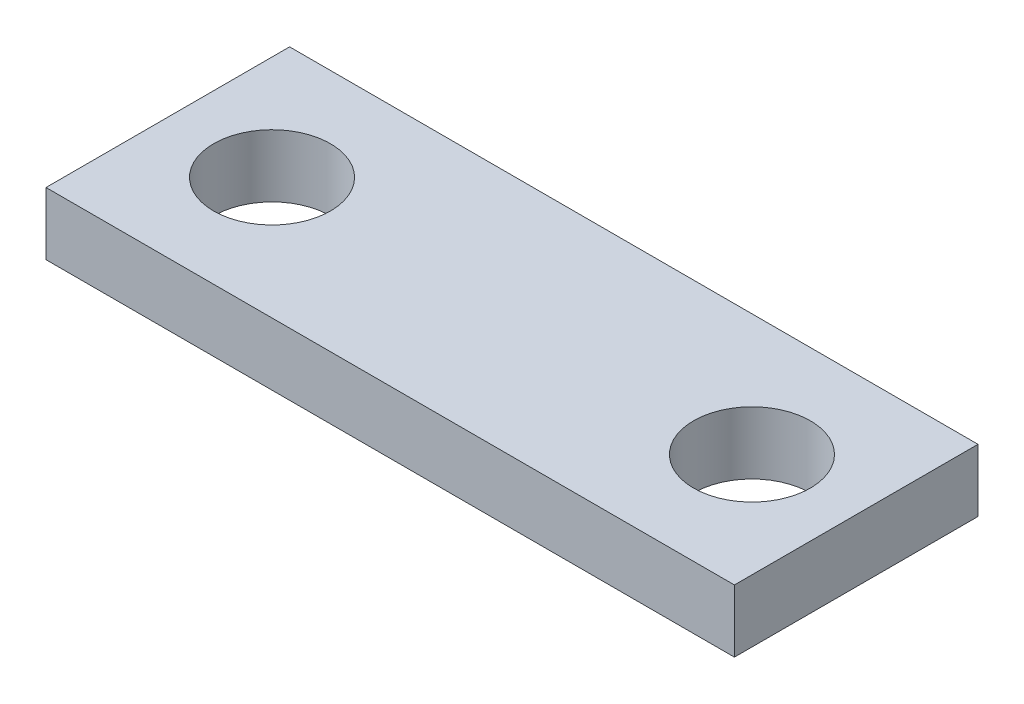
ISO-10303-21;
HEADER;
FILE_DESCRIPTION(('STEP AP214'),'2;1');
FILE_NAME('part.step','',(''),(''),'','','');
FILE_SCHEMA(('AUTOMOTIVE_DESIGN { 1 0 10303 214 1 1 1 1 }'));
ENDSEC;
DATA;
#1=APPLICATION_CONTEXT('core data for automotive mechanical design processes');
#2=APPLICATION_PROTOCOL_DEFINITION('international standard','automotive_design',2000,#1);
#3=PRODUCT_CONTEXT('',#1,'mechanical');
#4=PRODUCT('Part','Part','',(#3));
#5=PRODUCT_RELATED_PRODUCT_CATEGORY('part','',(#4));
#6=PRODUCT_DEFINITION_FORMATION('','',#4);
#7=PRODUCT_DEFINITION_CONTEXT('part definition',#1,'design');
#8=PRODUCT_DEFINITION('design','',#6,#7);
#9=PRODUCT_DEFINITION_SHAPE('','',#8);
#10=(LENGTH_UNIT() NAMED_UNIT(*) SI_UNIT(.MILLI.,.METRE.));
#11=(NAMED_UNIT(*) PLANE_ANGLE_UNIT() SI_UNIT($,.RADIAN.));
#12=(NAMED_UNIT(*) SI_UNIT($,.STERADIAN.) SOLID_ANGLE_UNIT());
#13=UNCERTAINTY_MEASURE_WITH_UNIT(LENGTH_MEASURE(1.E-05),#10,'distance_accuracy_value','');
#14=(GEOMETRIC_REPRESENTATION_CONTEXT(3) GLOBAL_UNCERTAINTY_ASSIGNED_CONTEXT((#13)) GLOBAL_UNIT_ASSIGNED_CONTEXT((#10,
#11,#12)) REPRESENTATION_CONTEXT('',''));
#15=CARTESIAN_POINT('',(0.,0.,0.));
#16=DIRECTION('',(0.,0.,1.));
#17=DIRECTION('',(1.,0.,0.));
#18=AXIS2_PLACEMENT_3D('',#15,#16,#17);
#19=CARTESIAN_POINT('',(8.255,1.5,2.921));
#20=DIRECTION('',(-1.,0.,0.));
#21=DIRECTION('',(0.,0.,1.));
#22=AXIS2_PLACEMENT_3D('',#19,#20,#21);
#23=PLANE('',#22);
#24=DIRECTION('',(0.,0.,-1.));
#25=VECTOR('',#24,1.);
#26=CARTESIAN_POINT('',(8.255,0.,2.921));
#27=LINE('',#26,#25);
#28=CARTESIAN_POINT('',(8.255,0.,2.921));
#29=VERTEX_POINT('',#28);
#30=CARTESIAN_POINT('',(8.255,0.,-2.921));
#31=VERTEX_POINT('',#30);
#32=EDGE_CURVE('E96',#29,#31,#27,.T.);
#33=ORIENTED_EDGE('',*,*,#32,.T.);
#34=DIRECTION('',(0.,-1.,0.));
#35=VECTOR('',#34,1.);
#36=CARTESIAN_POINT('',(8.255,1.5,-2.921));
#37=LINE('',#36,#35);
#38=CARTESIAN_POINT('',(8.255,1.5,-2.921));
#39=VERTEX_POINT('',#38);
#40=EDGE_CURVE('E11',#39,#31,#37,.T.);
#41=ORIENTED_EDGE('',*,*,#40,.F.);
#42=DIRECTION('',(0.,0.,-1.));
#43=VECTOR('',#42,1.);
#44=CARTESIAN_POINT('',(8.255,1.5,2.921));
#45=LINE('',#44,#43);
#46=CARTESIAN_POINT('',(8.255,1.5,2.921));
#47=VERTEX_POINT('',#46);
#48=EDGE_CURVE('E84',#47,#39,#45,.T.);
#49=ORIENTED_EDGE('',*,*,#48,.F.);
#50=DIRECTION('',(0.,-1.,0.));
#51=VECTOR('',#50,1.);
#52=CARTESIAN_POINT('',(8.255,1.5,2.921));
#53=LINE('',#52,#51);
#54=EDGE_CURVE('E92',#47,#29,#53,.T.);
#55=ORIENTED_EDGE('',*,*,#54,.T.);
#56=EDGE_LOOP('',(#33,#41,#49,#55));
#57=FACE_BOUND('',#56,.T.);
#58=ADVANCED_FACE('F33',(#57),#23,.F.);
#59=CARTESIAN_POINT('',(-8.255,1.5,-2.921));
#60=DIRECTION('',(0.,0.,1.));
#61=DIRECTION('',(1.,0.,0.));
#62=AXIS2_PLACEMENT_3D('',#59,#60,#61);
#63=PLANE('',#62);
#64=DIRECTION('',(-1.,0.,0.));
#65=VECTOR('',#64,1.);
#66=CARTESIAN_POINT('',(-8.255,0.,-2.921));
#67=LINE('',#66,#65);
#68=CARTESIAN_POINT('',(-8.255,0.,-2.921));
#69=VERTEX_POINT('',#68);
#70=EDGE_CURVE('E88',#31,#69,#67,.T.);
#71=ORIENTED_EDGE('',*,*,#70,.T.);
#72=DIRECTION('',(0.,-1.,0.));
#73=VECTOR('',#72,1.);
#74=CARTESIAN_POINT('',(-8.255,1.5,-2.921));
#75=LINE('',#74,#73);
#76=CARTESIAN_POINT('',(-8.255,1.5,-2.921));
#77=VERTEX_POINT('',#76);
#78=EDGE_CURVE('E41',#77,#69,#75,.T.);
#79=ORIENTED_EDGE('',*,*,#78,.F.);
#80=DIRECTION('',(-1.,0.,0.));
#81=VECTOR('',#80,1.);
#82=CARTESIAN_POINT('',(-8.255,1.5,-2.921));
#83=LINE('',#82,#81);
#84=EDGE_CURVE('E79',#39,#77,#83,.T.);
#85=ORIENTED_EDGE('',*,*,#84,.F.);
#86=ORIENTED_EDGE('',*,*,#40,.T.);
#87=EDGE_LOOP('',(#71,#79,#85,#86));
#88=FACE_BOUND('',#87,.T.);
#89=ADVANCED_FACE('F87',(#88),#63,.F.);
#90=CARTESIAN_POINT('',(-8.255,1.5,2.921));
#91=DIRECTION('',(1.,0.,0.));
#92=DIRECTION('',(0.,0.,-1.));
#93=AXIS2_PLACEMENT_3D('',#90,#91,#92);
#94=PLANE('',#93);
#95=DIRECTION('',(0.,0.,1.));
#96=VECTOR('',#95,1.);
#97=CARTESIAN_POINT('',(-8.255,0.,2.921));
#98=LINE('',#97,#96);
#99=CARTESIAN_POINT('',(-8.255,0.,2.921));
#100=VERTEX_POINT('',#99);
#101=EDGE_CURVE('E66',#69,#100,#98,.T.);
#102=ORIENTED_EDGE('',*,*,#101,.T.);
#103=DIRECTION('',(0.,-1.,0.));
#104=VECTOR('',#103,1.);
#105=CARTESIAN_POINT('',(-8.255,1.5,2.921));
#106=LINE('',#105,#104);
#107=CARTESIAN_POINT('',(-8.255,1.5,2.921));
#108=VERTEX_POINT('',#107);
#109=EDGE_CURVE('E89',#108,#100,#106,.T.);
#110=ORIENTED_EDGE('',*,*,#109,.F.);
#111=DIRECTION('',(0.,0.,1.));
#112=VECTOR('',#111,1.);
#113=CARTESIAN_POINT('',(-8.255,1.5,2.921));
#114=LINE('',#113,#112);
#115=EDGE_CURVE('E82',#77,#108,#114,.T.);
#116=ORIENTED_EDGE('',*,*,#115,.F.);
#117=ORIENTED_EDGE('',*,*,#78,.T.);
#118=EDGE_LOOP('',(#102,#110,#116,#117));
#119=FACE_BOUND('',#118,.T.);
#120=ADVANCED_FACE('F90',(#119),#94,.F.);
#121=CARTESIAN_POINT('',(-8.255,1.5,2.921));
#122=DIRECTION('',(0.,0.,-1.));
#123=DIRECTION('',(-1.,0.,0.));
#124=AXIS2_PLACEMENT_3D('',#121,#122,#123);
#125=PLANE('',#124);
#126=DIRECTION('',(1.,0.,0.));
#127=VECTOR('',#126,1.);
#128=CARTESIAN_POINT('',(-8.255,0.,2.921));
#129=LINE('',#128,#127);
#130=EDGE_CURVE('E72',#100,#29,#129,.T.);
#131=ORIENTED_EDGE('',*,*,#130,.T.);
#132=ORIENTED_EDGE('',*,*,#54,.F.);
#133=DIRECTION('',(1.,0.,0.));
#134=VECTOR('',#133,1.);
#135=CARTESIAN_POINT('',(-8.255,1.5,2.921));
#136=LINE('',#135,#134);
#137=EDGE_CURVE('E49',#108,#47,#136,.T.);
#138=ORIENTED_EDGE('',*,*,#137,.F.);
#139=ORIENTED_EDGE('',*,*,#109,.T.);
#140=EDGE_LOOP('',(#131,#132,#138,#139));
#141=FACE_BOUND('',#140,.T.);
#142=ADVANCED_FACE('F104',(#141),#125,.F.);
#143=CARTESIAN_POINT('',(0.,1.5,0.));
#144=DIRECTION('',(0.,-1.,0.));
#145=DIRECTION('',(0.,0.,-1.));
#146=AXIS2_PLACEMENT_3D('',#143,#144,#145);
#147=PLANE('',#146);
#148=CARTESIAN_POINT('',(5.755,1.5,0.));
#149=DIRECTION('',(0.,1.,0.));
#150=DIRECTION('',(0.,0.,1.));
#151=AXIS2_PLACEMENT_3D('',#148,#149,#150);
#152=CIRCLE('',#151,1.4);
#153=CARTESIAN_POINT('',(5.755,1.5,1.4));
#154=VERTEX_POINT('',#153);
#155=EDGE_CURVE('E116',#154,#154,#152,.T.);
#156=ORIENTED_EDGE('',*,*,#155,.F.);
#157=EDGE_LOOP('',(#156));
#158=FACE_BOUND('',#157,.T.);
#159=CARTESIAN_POINT('',(-5.755,1.5,0.));
#160=DIRECTION('',(0.,1.,0.));
#161=DIRECTION('',(0.,0.,1.));
#162=AXIS2_PLACEMENT_3D('',#159,#160,#161);
#163=CIRCLE('',#162,1.4);
#164=CARTESIAN_POINT('',(-5.755,1.5,1.4));
#165=VERTEX_POINT('',#164);
#166=EDGE_CURVE('E110',#165,#165,#163,.T.);
#167=ORIENTED_EDGE('',*,*,#166,.F.);
#168=EDGE_LOOP('',(#167));
#169=FACE_BOUND('',#168,.T.);
#170=ORIENTED_EDGE('',*,*,#48,.T.);
#171=ORIENTED_EDGE('',*,*,#84,.T.);
#172=ORIENTED_EDGE('',*,*,#115,.T.);
#173=ORIENTED_EDGE('',*,*,#137,.T.);
#174=EDGE_LOOP('',(#170,#171,#172,#173));
#175=FACE_BOUND('',#174,.T.);
#176=ADVANCED_FACE('F80',(#158,#169,#175),#147,.F.);
#177=CARTESIAN_POINT('',(0.,0.,0.));
#178=DIRECTION('',(0.,-1.,0.));
#179=DIRECTION('',(0.,0.,-1.));
#180=AXIS2_PLACEMENT_3D('',#177,#178,#179);
#181=PLANE('',#180);
#182=CARTESIAN_POINT('',(5.755,0.,0.));
#183=DIRECTION('',(0.,1.,0.));
#184=DIRECTION('',(0.,0.,1.));
#185=AXIS2_PLACEMENT_3D('',#182,#183,#184);
#186=CIRCLE('',#185,1.4);
#187=CARTESIAN_POINT('',(5.755,0.,1.4));
#188=VERTEX_POINT('',#187);
#189=EDGE_CURVE('E113',#188,#188,#186,.T.);
#190=ORIENTED_EDGE('',*,*,#189,.T.);
#191=EDGE_LOOP('',(#190));
#192=FACE_BOUND('',#191,.T.);
#193=CARTESIAN_POINT('',(-5.755,0.,0.));
#194=DIRECTION('',(0.,1.,0.));
#195=DIRECTION('',(0.,0.,1.));
#196=AXIS2_PLACEMENT_3D('',#193,#194,#195);
#197=CIRCLE('',#196,1.4);
#198=CARTESIAN_POINT('',(-5.755,0.,1.4));
#199=VERTEX_POINT('',#198);
#200=EDGE_CURVE('E99',#199,#199,#197,.T.);
#201=ORIENTED_EDGE('',*,*,#200,.T.);
#202=EDGE_LOOP('',(#201));
#203=FACE_BOUND('',#202,.T.);
#204=ORIENTED_EDGE('',*,*,#32,.F.);
#205=ORIENTED_EDGE('',*,*,#130,.F.);
#206=ORIENTED_EDGE('',*,*,#101,.F.);
#207=ORIENTED_EDGE('',*,*,#70,.F.);
#208=EDGE_LOOP('',(#204,#205,#206,#207));
#209=FACE_BOUND('',#208,.T.);
#210=ADVANCED_FACE('F107',(#192,#203,#209),#181,.T.);
#211=CARTESIAN_POINT('',(-5.755,0.,0.));
#212=DIRECTION('',(0.,1.,0.));
#213=DIRECTION('',(0.,0.,1.));
#214=AXIS2_PLACEMENT_3D('',#211,#212,#213);
#215=CYLINDRICAL_SURFACE('',#214,1.4);
#216=ORIENTED_EDGE('',*,*,#200,.F.);
#217=EDGE_LOOP('',(#216));
#218=FACE_BOUND('',#217,.T.);
#219=ORIENTED_EDGE('',*,*,#166,.T.);
#220=EDGE_LOOP('',(#219));
#221=FACE_BOUND('',#220,.T.);
#222=ADVANCED_FACE('F127',(#218,#221),#215,.F.);
#223=CARTESIAN_POINT('',(5.755,0.,0.));
#224=DIRECTION('',(0.,1.,0.));
#225=DIRECTION('',(0.,0.,1.));
#226=AXIS2_PLACEMENT_3D('',#223,#224,#225);
#227=CYLINDRICAL_SURFACE('',#226,1.4);
#228=ORIENTED_EDGE('',*,*,#189,.F.);
#229=EDGE_LOOP('',(#228));
#230=FACE_BOUND('',#229,.T.);
#231=ORIENTED_EDGE('',*,*,#155,.T.);
#232=EDGE_LOOP('',(#231));
#233=FACE_BOUND('',#232,.T.);
#234=ADVANCED_FACE('F124',(#230,#233),#227,.F.);
#235=CLOSED_SHELL('',(#58,#89,#120,#142,#176,#210,#222,#234));
#236=MANIFOLD_SOLID_BREP('B2',#235);
#237=ADVANCED_BREP_SHAPE_REPRESENTATION('',(#18,#236),#14);
#238=SHAPE_DEFINITION_REPRESENTATION(#9,#237);
ENDSEC;
END-ISO-10303-21;
